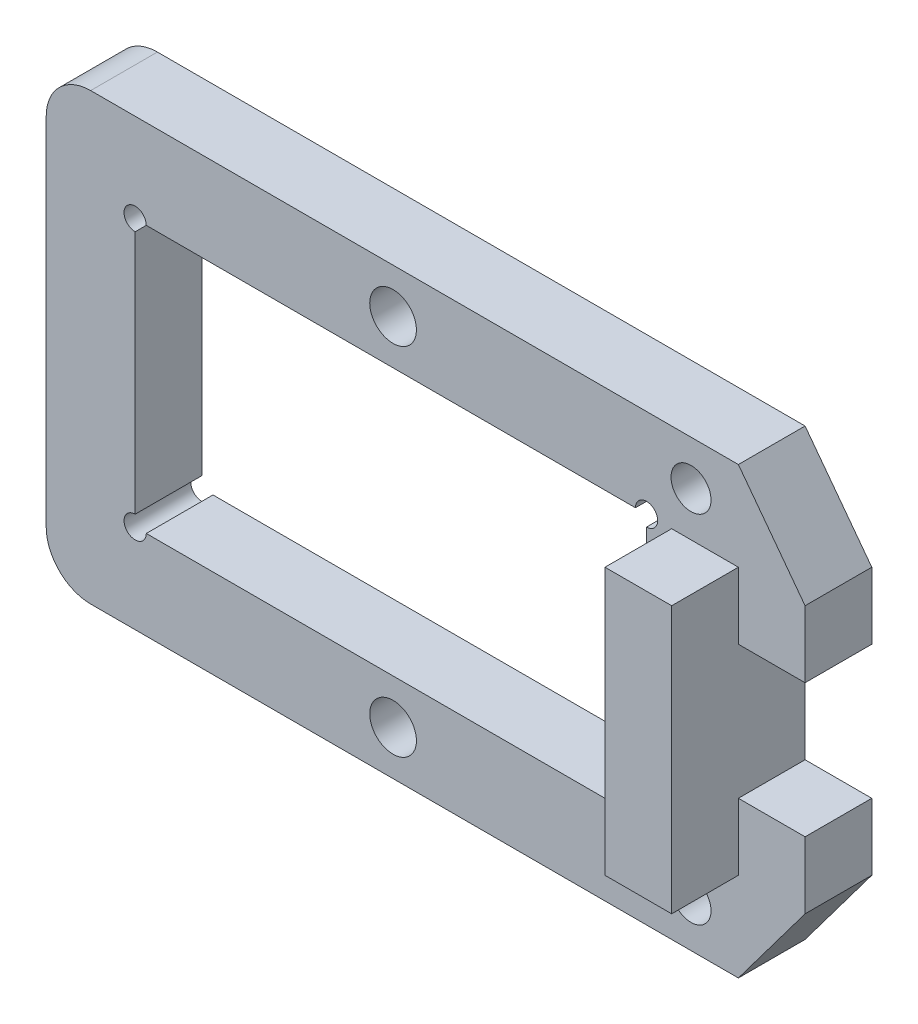
ISO-10303-21;
HEADER;
FILE_DESCRIPTION(('STEP AP214'),'2;1');
FILE_NAME('part.step','',(''),(''),'','','');
FILE_SCHEMA(('AUTOMOTIVE_DESIGN { 1 0 10303 214 1 1 1 1 }'));
ENDSEC;
DATA;
#1=APPLICATION_CONTEXT('core data for automotive mechanical design processes');
#2=APPLICATION_PROTOCOL_DEFINITION('international standard','automotive_design',2000,#1);
#3=PRODUCT_CONTEXT('',#1,'mechanical');
#4=PRODUCT('Part','Part','',(#3));
#5=PRODUCT_RELATED_PRODUCT_CATEGORY('part','',(#4));
#6=PRODUCT_DEFINITION_FORMATION('','',#4);
#7=PRODUCT_DEFINITION_CONTEXT('part definition',#1,'design');
#8=PRODUCT_DEFINITION('design','',#6,#7);
#9=PRODUCT_DEFINITION_SHAPE('','',#8);
#10=(LENGTH_UNIT() NAMED_UNIT(*) SI_UNIT(.MILLI.,.METRE.));
#11=(NAMED_UNIT(*) PLANE_ANGLE_UNIT() SI_UNIT($,.RADIAN.));
#12=(NAMED_UNIT(*) SI_UNIT($,.STERADIAN.) SOLID_ANGLE_UNIT());
#13=UNCERTAINTY_MEASURE_WITH_UNIT(LENGTH_MEASURE(1.E-05),#10,'distance_accuracy_value','');
#14=(GEOMETRIC_REPRESENTATION_CONTEXT(3) GLOBAL_UNCERTAINTY_ASSIGNED_CONTEXT((#13)) GLOBAL_UNIT_ASSIGNED_CONTEXT((#10,
#11,#12)) REPRESENTATION_CONTEXT('',''));
#15=CARTESIAN_POINT('',(0.,0.,0.));
#16=DIRECTION('',(0.,0.,1.));
#17=DIRECTION('',(1.,0.,0.));
#18=AXIS2_PLACEMENT_3D('',#15,#16,#17);
#19=CARTESIAN_POINT('',(26.7499927431345,15.9999988973141,-1.));
#20=DIRECTION('',(0.,1.,0.));
#21=DIRECTION('',(0.,0.,1.));
#22=AXIS2_PLACEMENT_3D('',#19,#20,#21);
#23=PLANE('',#22);
#24=DIRECTION('',(0.,0.,1.));
#25=VECTOR('',#24,1.);
#26=CARTESIAN_POINT('',(27.1299927431345,15.9999988973141,-1.));
#27=LINE('',#26,#25);
#28=CARTESIAN_POINT('',(27.1299927431345,15.9999988973141,-1.));
#29=VERTEX_POINT('',#28);
#30=CARTESIAN_POINT('',(27.1299927431345,15.9999988973141,2.));
#31=VERTEX_POINT('',#30);
#32=EDGE_CURVE('E393',#29,#31,#27,.T.);
#33=ORIENTED_EDGE('',*,*,#32,.F.);
#34=DIRECTION('',(-1.,0.,0.));
#35=VECTOR('',#34,1.);
#36=CARTESIAN_POINT('',(26.7499927431345,15.9999988973141,-1.));
#37=LINE('',#36,#35);
#38=CARTESIAN_POINT('',(-1.99999660622837,16.0000006891948,-1.));
#39=VERTEX_POINT('',#38);
#40=EDGE_CURVE('E314',#29,#39,#37,.T.);
#41=ORIENTED_EDGE('',*,*,#40,.T.);
#42=DIRECTION('',(0.,0.,1.));
#43=VECTOR('',#42,1.);
#44=CARTESIAN_POINT('',(-1.99999660622837,16.0000006891948,-1.));
#45=LINE('',#44,#43);
#46=CARTESIAN_POINT('',(-1.99999660622837,16.0000006891948,2.));
#47=VERTEX_POINT('',#46);
#48=EDGE_CURVE('E327',#39,#47,#45,.T.);
#49=ORIENTED_EDGE('',*,*,#48,.T.);
#50=DIRECTION('',(-1.,0.,0.));
#51=VECTOR('',#50,1.);
#52=CARTESIAN_POINT('',(26.7499927431345,15.9999988973141,2.));
#53=LINE('',#52,#51);
#54=EDGE_CURVE('E292',#31,#47,#53,.T.);
#55=ORIENTED_EDGE('',*,*,#54,.F.);
#56=EDGE_LOOP('',(#33,#41,#49,#55));
#57=FACE_BOUND('',#56,.T.);
#58=ADVANCED_FACE('F40',(#57),#23,.T.);
#59=CARTESIAN_POINT('',(26.7500020563602,-4.00000018998981,-1.));
#60=DIRECTION('',(1.2277400731051E-08,-1.,0.));
#61=DIRECTION('',(1.,1.2277400731051E-08,0.));
#62=AXIS2_PLACEMENT_3D('',#59,#60,#61);
#63=PLANE('',#62);
#64=DIRECTION('',(1.,1.2277400731051E-08,0.));
#65=VECTOR('',#64,1.);
#66=CARTESIAN_POINT('',(26.7500020563602,-4.00000018998981,-1.));
#67=LINE('',#66,#65);
#68=CARTESIAN_POINT('',(-2.00000016543505,-4.0000005429651,-1.));
#69=VERTEX_POINT('',#68);
#70=CARTESIAN_POINT('',(27.1300020563602,-4.00000018998981,-1.));
#71=VERTEX_POINT('',#70);
#72=EDGE_CURVE('E325',#69,#71,#67,.T.);
#73=ORIENTED_EDGE('',*,*,#72,.T.);
#74=DIRECTION('',(0.,0.,1.));
#75=VECTOR('',#74,1.);
#76=CARTESIAN_POINT('',(27.1300020563602,-4.00000018998981,-1.));
#77=LINE('',#76,#75);
#78=CARTESIAN_POINT('',(27.1300020563602,-4.00000018998981,2.));
#79=VERTEX_POINT('',#78);
#80=EDGE_CURVE('E407',#71,#79,#77,.T.);
#81=ORIENTED_EDGE('',*,*,#80,.T.);
#82=DIRECTION('',(1.,1.2277400731051E-08,0.));
#83=VECTOR('',#82,1.);
#84=CARTESIAN_POINT('',(26.7500020563602,-4.00000018998981,2.));
#85=LINE('',#84,#83);
#86=CARTESIAN_POINT('',(-2.00000016543505,-4.0000005429651,2.));
#87=VERTEX_POINT('',#86);
#88=EDGE_CURVE('E303',#87,#79,#85,.T.);
#89=ORIENTED_EDGE('',*,*,#88,.F.);
#90=DIRECTION('',(0.,0.,1.));
#91=VECTOR('',#90,1.);
#92=CARTESIAN_POINT('',(-2.00000016543505,-4.0000005429651,-1.));
#93=LINE('',#92,#91);
#94=EDGE_CURVE('E328',#69,#87,#93,.T.);
#95=ORIENTED_EDGE('',*,*,#94,.F.);
#96=EDGE_LOOP('',(#73,#81,#89,#95));
#97=FACE_BOUND('',#96,.T.);
#98=ADVANCED_FACE('F383',(#97),#63,.T.);
#99=CARTESIAN_POINT('',(11.5999998100102,-2.00000037599245,-1.));
#100=DIRECTION('',(0.,0.,1.));
#101=DIRECTION('',(1.,0.,0.));
#102=AXIS2_PLACEMENT_3D('',#99,#100,#101);
#103=CYLINDRICAL_SURFACE('',#102,1.05);
#104=CARTESIAN_POINT('',(11.5999998100102,-2.00000037599245,2.));
#105=DIRECTION('',(0.,0.,1.));
#106=DIRECTION('',(1.,0.,0.));
#107=AXIS2_PLACEMENT_3D('',#104,#105,#106);
#108=CIRCLE('',#107,1.05);
#109=CARTESIAN_POINT('',(12.6499998100102,-2.00000037599245,2.));
#110=VERTEX_POINT('',#109);
#111=EDGE_CURVE('E289',#110,#110,#108,.T.);
#112=ORIENTED_EDGE('',*,*,#111,.T.);
#113=EDGE_LOOP('',(#112));
#114=FACE_BOUND('',#113,.T.);
#115=CARTESIAN_POINT('',(11.5999998100102,-2.00000037599245,-1.));
#116=DIRECTION('',(0.,0.,-1.));
#117=DIRECTION('',(-1.,0.,0.));
#118=AXIS2_PLACEMENT_3D('',#115,#116,#117);
#119=CIRCLE('',#118,1.05);
#120=CARTESIAN_POINT('',(10.5499998100102,-2.00000037599245,-1.));
#121=VERTEX_POINT('',#120);
#122=EDGE_CURVE('E468',#121,#121,#119,.F.);
#123=ORIENTED_EDGE('',*,*,#122,.F.);
#124=EDGE_LOOP('',(#123));
#125=FACE_BOUND('',#124,.T.);
#126=ADVANCED_FACE('F388',(#114,#125),#103,.F.);
#127=CARTESIAN_POINT('',(11.5999998100102,13.9999987303414,-1.));
#128=DIRECTION('',(0.,0.,1.));
#129=DIRECTION('',(1.,0.,0.));
#130=AXIS2_PLACEMENT_3D('',#127,#128,#129);
#131=CYLINDRICAL_SURFACE('',#130,1.05);
#132=CARTESIAN_POINT('',(11.5999998100102,13.9999987303414,2.));
#133=DIRECTION('',(0.,0.,1.));
#134=DIRECTION('',(-1.,0.,0.));
#135=AXIS2_PLACEMENT_3D('',#132,#133,#134);
#136=CIRCLE('',#135,1.05);
#137=CARTESIAN_POINT('',(10.5499998100102,13.9999987303414,2.));
#138=VERTEX_POINT('',#137);
#139=EDGE_CURVE('E286',#138,#138,#136,.T.);
#140=ORIENTED_EDGE('',*,*,#139,.T.);
#141=EDGE_LOOP('',(#140));
#142=FACE_BOUND('',#141,.T.);
#143=CARTESIAN_POINT('',(11.5999998100102,13.9999987303414,-1.));
#144=DIRECTION('',(0.,0.,-1.));
#145=DIRECTION('',(-1.,0.,0.));
#146=AXIS2_PLACEMENT_3D('',#143,#144,#145);
#147=CIRCLE('',#146,1.05);
#148=CARTESIAN_POINT('',(10.5499998100102,13.9999987303414,-1.));
#149=VERTEX_POINT('',#148);
#150=EDGE_CURVE('E470',#149,#149,#147,.F.);
#151=ORIENTED_EDGE('',*,*,#150,.F.);
#152=EDGE_LOOP('',(#151));
#153=FACE_BOUND('',#152,.T.);
#154=ADVANCED_FACE('F532',(#142,#153),#131,.F.);
#155=CARTESIAN_POINT('',(22.9999998100102,-8.22825516055836E-07,-1.));
#156=DIRECTION('',(0.,-1.,0.));
#157=DIRECTION('',(1.,0.,0.));
#158=AXIS2_PLACEMENT_3D('',#155,#156,#157);
#159=PLANE('',#158);
#160=DIRECTION('',(1.,0.,0.));
#161=VECTOR('',#160,1.);
#162=CARTESIAN_POINT('',(22.9999998100102,-8.22825516055836E-07,-1.));
#163=LINE('',#162,#161);
#164=CARTESIAN_POINT('',(0.499999810010197,-8.22825517752848E-07,-0.999999999999999));
#165=VERTEX_POINT('',#164);
#166=CARTESIAN_POINT('',(22.4999998100102,-8.22825516093548E-07,-1.));
#167=VERTEX_POINT('',#166);
#168=EDGE_CURVE('E54',#165,#167,#163,.T.);
#169=ORIENTED_EDGE('',*,*,#168,.F.);
#170=DIRECTION('',(0.,0.,1.));
#171=VECTOR('',#170,1.);
#172=CARTESIAN_POINT('',(0.499999810010197,-8.22825517752848E-07,-9.));
#173=LINE('',#172,#171);
#174=CARTESIAN_POINT('',(0.499999810010197,-8.22825517752848E-07,2.));
#175=VERTEX_POINT('',#174);
#176=EDGE_CURVE('E266',#165,#175,#173,.T.);
#177=ORIENTED_EDGE('',*,*,#176,.T.);
#178=DIRECTION('',(1.,0.,0.));
#179=VECTOR('',#178,1.);
#180=CARTESIAN_POINT('',(22.9999998100102,-8.22825516055836E-07,2.));
#181=LINE('',#180,#179);
#182=CARTESIAN_POINT('',(22.4999998100102,-8.22825516093548E-07,2.));
#183=VERTEX_POINT('',#182);
#184=EDGE_CURVE('E283',#175,#183,#181,.T.);
#185=ORIENTED_EDGE('',*,*,#184,.T.);
#186=DIRECTION('',(0.,0.,1.));
#187=VECTOR('',#186,1.);
#188=CARTESIAN_POINT('',(22.4999998100102,-8.22825516093548E-07,-9.));
#189=LINE('',#188,#187);
#190=EDGE_CURVE('E12',#183,#167,#189,.F.);
#191=ORIENTED_EDGE('',*,*,#190,.T.);
#192=EDGE_LOOP('',(#169,#177,#185,#191));
#193=FACE_BOUND('',#192,.T.);
#194=ADVANCED_FACE('F365',(#193),#159,.F.);
#195=CARTESIAN_POINT('',(22.9999998100102,11.9999991771745,-1.));
#196=DIRECTION('',(0.,1.,0.));
#197=DIRECTION('',(-1.,0.,0.));
#198=AXIS2_PLACEMENT_3D('',#195,#196,#197);
#199=PLANE('',#198);
#200=DIRECTION('',(-1.,0.,0.));
#201=VECTOR('',#200,1.);
#202=CARTESIAN_POINT('',(22.9999998100102,11.9999991771745,-1.));
#203=LINE('',#202,#201);
#204=CARTESIAN_POINT('',(22.4999998100102,11.9999991771745,-0.999999999999999));
#205=VERTEX_POINT('',#204);
#206=CARTESIAN_POINT('',(0.499999810010195,11.9999991771745,-1.));
#207=VERTEX_POINT('',#206);
#208=EDGE_CURVE('E308',#205,#207,#203,.T.);
#209=ORIENTED_EDGE('',*,*,#208,.F.);
#210=DIRECTION('',(0.,0.,1.));
#211=VECTOR('',#210,1.);
#212=CARTESIAN_POINT('',(22.4999998100102,11.9999991771745,-9.));
#213=LINE('',#212,#211);
#214=CARTESIAN_POINT('',(22.4999998100102,11.9999991771745,2.));
#215=VERTEX_POINT('',#214);
#216=EDGE_CURVE('E339',#205,#215,#213,.T.);
#217=ORIENTED_EDGE('',*,*,#216,.T.);
#218=DIRECTION('',(-1.,0.,0.));
#219=VECTOR('',#218,1.);
#220=CARTESIAN_POINT('',(22.9999998100102,11.9999991771745,2.));
#221=LINE('',#220,#219);
#222=CARTESIAN_POINT('',(0.499999810010197,11.9999991771745,2.));
#223=VERTEX_POINT('',#222);
#224=EDGE_CURVE('E277',#215,#223,#221,.T.);
#225=ORIENTED_EDGE('',*,*,#224,.T.);
#226=DIRECTION('',(0.,0.,1.));
#227=VECTOR('',#226,1.);
#228=CARTESIAN_POINT('',(0.499999810010197,11.9999991771745,-9.));
#229=LINE('',#228,#227);
#230=EDGE_CURVE('E330',#223,#207,#229,.F.);
#231=ORIENTED_EDGE('',*,*,#230,.T.);
#232=EDGE_LOOP('',(#209,#217,#225,#231));
#233=FACE_BOUND('',#232,.T.);
#234=ADVANCED_FACE('F354',(#233),#199,.F.);
#235=CARTESIAN_POINT('',(-1.99999660622837,13.9999988973141,2.));
#236=DIRECTION('',(0.,0.,-1.));
#237=DIRECTION('',(-1.,0.,0.));
#238=AXIS2_PLACEMENT_3D('',#235,#236,#237);
#239=PLANE('',#238);
#240=ORIENTED_EDGE('',*,*,#224,.F.);
#241=CARTESIAN_POINT('',(22.9999998100102,11.9999991771745,2.));
#242=DIRECTION('',(0.,0.,1.));
#243=DIRECTION('',(1.,0.,0.));
#244=AXIS2_PLACEMENT_3D('',#241,#242,#243);
#245=CIRCLE('',#244,0.499999999999999);
#246=CARTESIAN_POINT('',(22.9999998100102,11.4999991771745,2.));
#247=VERTEX_POINT('',#246);
#248=EDGE_CURVE('E212',#247,#215,#245,.T.);
#249=ORIENTED_EDGE('',*,*,#248,.F.);
#250=DIRECTION('',(0.,1.,0.));
#251=VECTOR('',#250,1.);
#252=CARTESIAN_POINT('',(22.9999998100102,11.9999991771745,2.));
#253=LINE('',#252,#251);
#254=CARTESIAN_POINT('',(22.9999998100102,0.499999177174483,2.));
#255=VERTEX_POINT('',#254);
#256=EDGE_CURVE('E274',#255,#247,#253,.T.);
#257=ORIENTED_EDGE('',*,*,#256,.F.);
#258=CARTESIAN_POINT('',(22.9999998100102,-8.22825516055836E-07,2.));
#259=DIRECTION('',(0.,0.,1.));
#260=DIRECTION('',(1.,0.,0.));
#261=AXIS2_PLACEMENT_3D('',#258,#259,#260);
#262=CIRCLE('',#261,0.499999999999999);
#263=EDGE_CURVE('E250',#183,#255,#262,.T.);
#264=ORIENTED_EDGE('',*,*,#263,.F.);
#265=ORIENTED_EDGE('',*,*,#184,.F.);
#266=CARTESIAN_POINT('',(-1.89989803403567E-07,-8.22825517639714E-07,2.));
#267=DIRECTION('',(0.,0.,1.));
#268=DIRECTION('',(1.,0.,0.));
#269=AXIS2_PLACEMENT_3D('',#266,#267,#268);
#270=CIRCLE('',#269,0.5);
#271=CARTESIAN_POINT('',(-1.89989803403567E-07,0.499999177174482,2.));
#272=VERTEX_POINT('',#271);
#273=EDGE_CURVE('E247',#272,#175,#270,.T.);
#274=ORIENTED_EDGE('',*,*,#273,.F.);
#275=DIRECTION('',(0.,-1.,0.));
#276=VECTOR('',#275,1.);
#277=CARTESIAN_POINT('',(-1.89989803403567E-07,11.9999991771745,2.));
#278=LINE('',#277,#276);
#279=CARTESIAN_POINT('',(-1.89989803403567E-07,11.4999991771745,2.));
#280=VERTEX_POINT('',#279);
#281=EDGE_CURVE('E280',#280,#272,#278,.T.);
#282=ORIENTED_EDGE('',*,*,#281,.F.);
#283=CARTESIAN_POINT('',(-1.89989803403567E-07,11.9999991771745,2.));
#284=DIRECTION('',(0.,0.,1.));
#285=DIRECTION('',(1.,0.,0.));
#286=AXIS2_PLACEMENT_3D('',#283,#284,#285);
#287=CIRCLE('',#286,0.5);
#288=EDGE_CURVE('E249',#223,#280,#287,.T.);
#289=ORIENTED_EDGE('',*,*,#288,.F.);
#290=EDGE_LOOP('',(#240,#249,#257,#264,#265,#274,#282,#289));
#291=FACE_BOUND('',#290,.T.);
#292=ORIENTED_EDGE('',*,*,#111,.F.);
#293=EDGE_LOOP('',(#292));
#294=FACE_BOUND('',#293,.T.);
#295=ORIENTED_EDGE('',*,*,#139,.F.);
#296=EDGE_LOOP('',(#295));
#297=FACE_BOUND('',#296,.T.);
#298=ORIENTED_EDGE('',*,*,#88,.T.);
#299=DIRECTION('',(0.599999831878138,0.800000126091369,0.));
#300=VECTOR('',#299,1.);
#301=CARTESIAN_POINT('',(30.1300006854534,-2.66596633657912E-07,2.));
#302=LINE('',#301,#300);
#303=CARTESIAN_POINT('',(30.1300006854534,-2.66596633657912E-07,2.));
#304=VERTEX_POINT('',#303);
#305=EDGE_CURVE('E447',#79,#304,#302,.T.);
#306=ORIENTED_EDGE('',*,*,#305,.T.);
#307=DIRECTION('',(1.86264626855528E-06,0.999999999998265,0.));
#308=VECTOR('',#307,1.);
#309=CARTESIAN_POINT('',(30.1300062733889,2.99999793060124,2.));
#310=LINE('',#309,#308);
#311=CARTESIAN_POINT('',(30.1300062733889,2.99999793060124,2.));
#312=VERTEX_POINT('',#311);
#313=EDGE_CURVE('E445',#304,#312,#310,.T.);
#314=ORIENTED_EDGE('',*,*,#313,.T.);
#315=DIRECTION('',(-1.,-5.72169204784613E-13,0.));
#316=VECTOR('',#315,1.);
#317=CARTESIAN_POINT('',(27.1300040622856,2.99999793059952,2.));
#318=LINE('',#317,#316);
#319=CARTESIAN_POINT('',(27.1300040622856,2.99999793059952,2.));
#320=VERTEX_POINT('',#319);
#321=EDGE_CURVE('E209',#312,#320,#318,.T.);
#322=ORIENTED_EDGE('',*,*,#321,.T.);
#323=DIRECTION('',(0.,1.,0.));
#324=VECTOR('',#323,1.);
#325=CARTESIAN_POINT('',(27.1300020563602,-2.84261419958298E-07,2.));
#326=LINE('',#325,#324);
#327=CARTESIAN_POINT('',(27.1300020563602,-2.84261419958298E-07,2.));
#328=VERTEX_POINT('',#327);
#329=EDGE_CURVE('E201',#328,#320,#326,.T.);
#330=ORIENTED_EDGE('',*,*,#329,.F.);
#331=DIRECTION('',(1.,0.,0.));
#332=VECTOR('',#331,1.);
#333=CARTESIAN_POINT('',(27.1300020563602,-2.84261419958298E-07,2.));
#334=LINE('',#333,#332);
#335=CARTESIAN_POINT('',(24.1300015646219,-2.84261419958298E-07,2.));
#336=VERTEX_POINT('',#335);
#337=EDGE_CURVE('E205',#336,#328,#334,.T.);
#338=ORIENTED_EDGE('',*,*,#337,.F.);
#339=DIRECTION('',(0.,-1.,0.));
#340=VECTOR('',#339,1.);
#341=CARTESIAN_POINT('',(24.1300015646219,-2.84261419958298E-07,2.));
#342=LINE('',#341,#340);
#343=CARTESIAN_POINT('',(24.1300015646219,12.0000001043081,2.));
#344=VERTEX_POINT('',#343);
#345=EDGE_CURVE('E225',#344,#336,#342,.T.);
#346=ORIENTED_EDGE('',*,*,#345,.F.);
#347=DIRECTION('',(-1.,0.,0.));
#348=VECTOR('',#347,1.);
#349=CARTESIAN_POINT('',(27.1300020563602,12.0000001043081,2.));
#350=LINE('',#349,#348);
#351=CARTESIAN_POINT('',(27.1300020563602,12.0000001043081,2.));
#352=VERTEX_POINT('',#351);
#353=EDGE_CURVE('E213',#352,#344,#350,.T.);
#354=ORIENTED_EDGE('',*,*,#353,.F.);
#355=CARTESIAN_POINT('',(27.1300057816505,8.99999774992466,2.));
#356=VERTEX_POINT('',#355);
#357=EDGE_CURVE('E215',#356,#352,#326,.T.);
#358=ORIENTED_EDGE('',*,*,#357,.F.);
#359=DIRECTION('',(1.,0.,0.));
#360=VECTOR('',#359,1.);
#361=CARTESIAN_POINT('',(30.1300062733889,8.99999774992466,2.));
#362=LINE('',#361,#360);
#363=CARTESIAN_POINT('',(30.1300062733889,8.99999774992466,2.));
#364=VERTEX_POINT('',#363);
#365=EDGE_CURVE('E441',#356,#364,#362,.T.);
#366=ORIENTED_EDGE('',*,*,#365,.T.);
#367=DIRECTION('',(-4.34616860398201E-06,0.999999999990555,0.));
#368=VECTOR('',#367,1.);
#369=CARTESIAN_POINT('',(30.1299932348728,12.0000001043081,2.));
#370=LINE('',#369,#368);
#371=CARTESIAN_POINT('',(30.1299932348728,12.0000001043081,2.));
#372=VERTEX_POINT('',#371);
#373=EDGE_CURVE('E438',#364,#372,#370,.T.);
#374=ORIENTED_EDGE('',*,*,#373,.T.);
#375=DIRECTION('',(-0.600000178813943,0.799999865889511,0.));
#376=VECTOR('',#375,1.);
#377=CARTESIAN_POINT('',(27.1299927431345,15.9999988973141,2.));
#378=LINE('',#377,#376);
#379=EDGE_CURVE('E436',#372,#31,#378,.T.);
#380=ORIENTED_EDGE('',*,*,#379,.T.);
#381=ORIENTED_EDGE('',*,*,#54,.T.);
#382=CARTESIAN_POINT('',(-1.99999660622837,13.9999988973141,2.));
#383=DIRECTION('',(0.,0.,1.));
#384=DIRECTION('',(-1.,0.,0.));
#385=AXIS2_PLACEMENT_3D('',#382,#383,#384);
#386=CIRCLE('',#385,2.00000179188074);
#387=CARTESIAN_POINT('',(-4.00000018998981,13.9999984493439,2.));
#388=VERTEX_POINT('',#387);
#389=EDGE_CURVE('E294',#47,#388,#386,.T.);
#390=ORIENTED_EDGE('',*,*,#389,.T.);
#391=DIRECTION('',(0.,-1.,0.));
#392=VECTOR('',#391,1.);
#393=CARTESIAN_POINT('',(-4.00000018998981,-2.0000000949949,2.));
#394=LINE('',#393,#392);
#395=CARTESIAN_POINT('',(-4.0000001899898,-2.0000000949949,2.));
#396=VERTEX_POINT('',#395);
#397=EDGE_CURVE('E297',#388,#396,#394,.T.);
#398=ORIENTED_EDGE('',*,*,#397,.T.);
#399=CARTESIAN_POINT('',(-2.00000018998985,-2.0000005429651,2.));
#400=DIRECTION('',(0.,0.,1.));
#401=DIRECTION('',(-1.,0.,0.));
#402=AXIS2_PLACEMENT_3D('',#399,#400,#401);
#403=CIRCLE('',#402,2.);
#404=EDGE_CURVE('E300',#396,#87,#403,.T.);
#405=ORIENTED_EDGE('',*,*,#404,.T.);
#406=EDGE_LOOP('',(#298,#306,#314,#322,#330,#338,#346,#354,#358,#366,#374,#380,#381,#390,#398,#405));
#407=FACE_BOUND('',#406,.T.);
#408=CARTESIAN_POINT('',(24.9999845424924,-2.00000054296511,2.));
#409=DIRECTION('',(0.,0.,1.));
#410=DIRECTION('',(-1.,0.,0.));
#411=AXIS2_PLACEMENT_3D('',#408,#409,#410);
#412=CIRCLE('',#411,0.9);
#413=CARTESIAN_POINT('',(24.0999845424924,-2.00000054296511,2.));
#414=VERTEX_POINT('',#413);
#415=EDGE_CURVE('E453',#414,#414,#412,.T.);
#416=ORIENTED_EDGE('',*,*,#415,.F.);
#417=EDGE_LOOP('',(#416));
#418=FACE_BOUND('',#417,.T.);
#419=CARTESIAN_POINT('',(24.9999845424924,13.9999988973141,2.));
#420=DIRECTION('',(0.,0.,1.));
#421=DIRECTION('',(1.,0.,0.));
#422=AXIS2_PLACEMENT_3D('',#419,#420,#421);
#423=CIRCLE('',#422,0.9);
#424=CARTESIAN_POINT('',(25.8999845424924,13.9999988973141,2.));
#425=VERTEX_POINT('',#424);
#426=EDGE_CURVE('E450',#425,#425,#423,.T.);
#427=ORIENTED_EDGE('',*,*,#426,.F.);
#428=EDGE_LOOP('',(#427));
#429=FACE_BOUND('',#428,.T.);
#430=ADVANCED_FACE('F203',(#291,#294,#297,#407,#418,#429),#239,.F.);
#431=CARTESIAN_POINT('',(-1.99999660622837,13.9999988973141,-1.));
#432=DIRECTION('',(0.,0.,-1.));
#433=DIRECTION('',(-1.,0.,0.));
#434=AXIS2_PLACEMENT_3D('',#431,#432,#433);
#435=PLANE('',#434);
#436=ORIENTED_EDGE('',*,*,#208,.T.);
#437=CARTESIAN_POINT('',(-1.89989803403567E-07,11.9999991771745,-0.999999999999999));
#438=DIRECTION('',(0.,0.,-1.));
#439=DIRECTION('',(-1.,0.,0.));
#440=AXIS2_PLACEMENT_3D('',#437,#438,#439);
#441=CIRCLE('',#440,0.5);
#442=CARTESIAN_POINT('',(-1.89989803403567E-07,11.4999991771745,-0.999999999999999));
#443=VERTEX_POINT('',#442);
#444=EDGE_CURVE('E254',#443,#207,#441,.T.);
#445=ORIENTED_EDGE('',*,*,#444,.F.);
#446=DIRECTION('',(0.,-1.,0.));
#447=VECTOR('',#446,1.);
#448=CARTESIAN_POINT('',(-1.89989803403567E-07,11.9999991771745,-1.));
#449=LINE('',#448,#447);
#450=CARTESIAN_POINT('',(-1.89989803403567E-07,0.499999177174483,-1.));
#451=VERTEX_POINT('',#450);
#452=EDGE_CURVE('E310',#443,#451,#449,.T.);
#453=ORIENTED_EDGE('',*,*,#452,.T.);
#454=CARTESIAN_POINT('',(-1.89989803403567E-07,-8.22825517639714E-07,-0.999999999999999));
#455=DIRECTION('',(0.,0.,-1.));
#456=DIRECTION('',(-1.,0.,0.));
#457=AXIS2_PLACEMENT_3D('',#454,#455,#456);
#458=CIRCLE('',#457,0.5);
#459=EDGE_CURVE('E61',#165,#451,#458,.T.);
#460=ORIENTED_EDGE('',*,*,#459,.F.);
#461=ORIENTED_EDGE('',*,*,#168,.T.);
#462=CARTESIAN_POINT('',(22.9999998100102,-8.22825516055836E-07,-0.999999999999999));
#463=DIRECTION('',(0.,0.,-1.));
#464=DIRECTION('',(-1.,0.,0.));
#465=AXIS2_PLACEMENT_3D('',#462,#463,#464);
#466=CIRCLE('',#465,0.499999999999999);
#467=CARTESIAN_POINT('',(22.9999998100102,0.499999177174483,-0.999999999999999));
#468=VERTEX_POINT('',#467);
#469=EDGE_CURVE('E269',#468,#167,#466,.T.);
#470=ORIENTED_EDGE('',*,*,#469,.F.);
#471=DIRECTION('',(0.,1.,0.));
#472=VECTOR('',#471,1.);
#473=CARTESIAN_POINT('',(22.9999998100102,11.9999991771745,-1.));
#474=LINE('',#473,#472);
#475=CARTESIAN_POINT('',(22.9999998100102,11.4999991771745,-0.999999999999999));
#476=VERTEX_POINT('',#475);
#477=EDGE_CURVE('E305',#468,#476,#474,.T.);
#478=ORIENTED_EDGE('',*,*,#477,.T.);
#479=CARTESIAN_POINT('',(22.9999998100102,11.9999991771745,-0.999999999999999));
#480=DIRECTION('',(0.,0.,-1.));
#481=DIRECTION('',(-1.,0.,0.));
#482=AXIS2_PLACEMENT_3D('',#479,#480,#481);
#483=CIRCLE('',#482,0.499999999999999);
#484=EDGE_CURVE('E260',#205,#476,#483,.T.);
#485=ORIENTED_EDGE('',*,*,#484,.F.);
#486=EDGE_LOOP('',(#436,#445,#453,#460,#461,#470,#478,#485));
#487=FACE_BOUND('',#486,.T.);
#488=ORIENTED_EDGE('',*,*,#40,.F.);
#489=DIRECTION('',(-0.600000178813943,0.799999865889511,0.));
#490=VECTOR('',#489,1.);
#491=CARTESIAN_POINT('',(27.1299927431345,15.9999988973141,-1.));
#492=LINE('',#491,#490);
#493=CARTESIAN_POINT('',(30.1299932348728,12.0000001043081,-1.));
#494=VERTEX_POINT('',#493);
#495=EDGE_CURVE('E402',#494,#29,#492,.T.);
#496=ORIENTED_EDGE('',*,*,#495,.F.);
#497=DIRECTION('',(-4.34616860398201E-06,0.999999999990555,0.));
#498=VECTOR('',#497,1.);
#499=CARTESIAN_POINT('',(30.1299932348728,12.0000001043081,-1.));
#500=LINE('',#499,#498);
#501=CARTESIAN_POINT('',(30.1300062733889,8.99999774992466,-1.));
#502=VERTEX_POINT('',#501);
#503=EDGE_CURVE('E406',#502,#494,#500,.T.);
#504=ORIENTED_EDGE('',*,*,#503,.F.);
#505=DIRECTION('',(1.,0.,0.));
#506=VECTOR('',#505,1.);
#507=CARTESIAN_POINT('',(30.1300062733889,8.99999774992466,-1.));
#508=LINE('',#507,#506);
#509=CARTESIAN_POINT('',(27.1300057816505,8.99999774992466,-1.));
#510=VERTEX_POINT('',#509);
#511=EDGE_CURVE('E409',#510,#502,#508,.T.);
#512=ORIENTED_EDGE('',*,*,#511,.F.);
#513=DIRECTION('',(2.86560837514496E-07,0.999999999999959,0.));
#514=VECTOR('',#513,1.);
#515=CARTESIAN_POINT('',(27.1300057816505,8.99999774992466,-1.));
#516=LINE('',#515,#514);
#517=CARTESIAN_POINT('',(27.1300040622856,2.99999793059952,-1.));
#518=VERTEX_POINT('',#517);
#519=EDGE_CURVE('E418',#518,#510,#516,.T.);
#520=ORIENTED_EDGE('',*,*,#519,.F.);
#521=DIRECTION('',(-1.,-5.72169204784613E-13,0.));
#522=VECTOR('',#521,1.);
#523=CARTESIAN_POINT('',(27.1300040622856,2.99999793059952,-1.));
#524=LINE('',#523,#522);
#525=CARTESIAN_POINT('',(30.1300062733889,2.99999793060124,-1.));
#526=VERTEX_POINT('',#525);
#527=EDGE_CURVE('E421',#526,#518,#524,.T.);
#528=ORIENTED_EDGE('',*,*,#527,.F.);
#529=DIRECTION('',(1.86264626855528E-06,0.999999999998265,0.));
#530=VECTOR('',#529,1.);
#531=CARTESIAN_POINT('',(30.1300062733889,2.99999793060124,-1.));
#532=LINE('',#531,#530);
#533=CARTESIAN_POINT('',(30.1300006854534,-2.66596633657912E-07,-1.));
#534=VERTEX_POINT('',#533);
#535=EDGE_CURVE('E424',#534,#526,#532,.T.);
#536=ORIENTED_EDGE('',*,*,#535,.F.);
#537=DIRECTION('',(0.599999831878138,0.800000126091369,0.));
#538=VECTOR('',#537,1.);
#539=CARTESIAN_POINT('',(30.1300006854534,-2.66596633657912E-07,-1.));
#540=LINE('',#539,#538);
#541=EDGE_CURVE('E427',#71,#534,#540,.T.);
#542=ORIENTED_EDGE('',*,*,#541,.F.);
#543=ORIENTED_EDGE('',*,*,#72,.F.);
#544=CARTESIAN_POINT('',(-2.00000018998985,-2.0000005429651,-1.));
#545=DIRECTION('',(0.,0.,1.));
#546=DIRECTION('',(-1.,0.,0.));
#547=AXIS2_PLACEMENT_3D('',#544,#545,#546);
#548=CIRCLE('',#547,2.);
#549=CARTESIAN_POINT('',(-4.0000001899898,-2.0000000949949,-1.));
#550=VERTEX_POINT('',#549);
#551=EDGE_CURVE('E322',#550,#69,#548,.T.);
#552=ORIENTED_EDGE('',*,*,#551,.F.);
#553=DIRECTION('',(0.,-1.,0.));
#554=VECTOR('',#553,1.);
#555=CARTESIAN_POINT('',(-4.00000018998981,-2.0000000949949,-1.));
#556=LINE('',#555,#554);
#557=CARTESIAN_POINT('',(-4.00000018998981,13.9999984493439,-1.));
#558=VERTEX_POINT('',#557);
#559=EDGE_CURVE('E319',#558,#550,#556,.T.);
#560=ORIENTED_EDGE('',*,*,#559,.F.);
#561=CARTESIAN_POINT('',(-1.99999660622837,13.9999988973141,-1.));
#562=DIRECTION('',(0.,0.,1.));
#563=DIRECTION('',(-1.,0.,0.));
#564=AXIS2_PLACEMENT_3D('',#561,#562,#563);
#565=CIRCLE('',#564,2.00000179188074);
#566=EDGE_CURVE('E316',#39,#558,#565,.T.);
#567=ORIENTED_EDGE('',*,*,#566,.F.);
#568=EDGE_LOOP('',(#488,#496,#504,#512,#520,#528,#536,#542,#543,#552,#560,#567));
#569=FACE_BOUND('',#568,.T.);
#570=ORIENTED_EDGE('',*,*,#150,.T.);
#571=EDGE_LOOP('',(#570));
#572=FACE_BOUND('',#571,.T.);
#573=CARTESIAN_POINT('',(24.9999845424924,13.9999988973141,-1.));
#574=DIRECTION('',(0.,0.,1.));
#575=DIRECTION('',(1.,0.,0.));
#576=AXIS2_PLACEMENT_3D('',#573,#574,#575);
#577=CIRCLE('',#576,0.9);
#578=CARTESIAN_POINT('',(25.8999845424924,13.9999988973141,-1.));
#579=VERTEX_POINT('',#578);
#580=EDGE_CURVE('E430',#579,#579,#577,.T.);
#581=ORIENTED_EDGE('',*,*,#580,.T.);
#582=EDGE_LOOP('',(#581));
#583=FACE_BOUND('',#582,.T.);
#584=CARTESIAN_POINT('',(24.9999845424924,-2.00000054296511,-1.));
#585=DIRECTION('',(0.,0.,1.));
#586=DIRECTION('',(-1.,0.,0.));
#587=AXIS2_PLACEMENT_3D('',#584,#585,#586);
#588=CIRCLE('',#587,0.9);
#589=CARTESIAN_POINT('',(24.0999845424924,-2.00000054296511,-1.));
#590=VERTEX_POINT('',#589);
#591=EDGE_CURVE('E433',#590,#590,#588,.T.);
#592=ORIENTED_EDGE('',*,*,#591,.T.);
#593=EDGE_LOOP('',(#592));
#594=FACE_BOUND('',#593,.T.);
#595=ORIENTED_EDGE('',*,*,#122,.T.);
#596=EDGE_LOOP('',(#595));
#597=FACE_BOUND('',#596,.T.);
#598=ADVANCED_FACE('F347',(#487,#569,#572,#583,#594,#597),#435,.T.);
#599=CARTESIAN_POINT('',(-2.00000018998985,-2.0000005429651,-1.));
#600=DIRECTION('',(0.,0.,1.));
#601=DIRECTION('',(1.,0.,0.));
#602=AXIS2_PLACEMENT_3D('',#599,#600,#601);
#603=CYLINDRICAL_SURFACE('',#602,2.);
#604=ORIENTED_EDGE('',*,*,#94,.T.);
#605=ORIENTED_EDGE('',*,*,#404,.F.);
#606=DIRECTION('',(0.,0.,1.));
#607=VECTOR('',#606,1.);
#608=CARTESIAN_POINT('',(-4.0000001899898,-2.0000000949949,-1.));
#609=LINE('',#608,#607);
#610=EDGE_CURVE('E331',#550,#396,#609,.T.);
#611=ORIENTED_EDGE('',*,*,#610,.F.);
#612=ORIENTED_EDGE('',*,*,#551,.T.);
#613=EDGE_LOOP('',(#604,#605,#611,#612));
#614=FACE_BOUND('',#613,.T.);
#615=ADVANCED_FACE('F510',(#614),#603,.T.);
#616=CARTESIAN_POINT('',(-4.00000018998981,-2.0000000949949,-1.));
#617=DIRECTION('',(-1.,0.,0.));
#618=DIRECTION('',(0.,0.,1.));
#619=AXIS2_PLACEMENT_3D('',#616,#617,#618);
#620=PLANE('',#619);
#621=ORIENTED_EDGE('',*,*,#610,.T.);
#622=ORIENTED_EDGE('',*,*,#397,.F.);
#623=DIRECTION('',(0.,0.,1.));
#624=VECTOR('',#623,1.);
#625=CARTESIAN_POINT('',(-4.00000018998981,13.9999984493439,-1.));
#626=LINE('',#625,#624);
#627=EDGE_CURVE('E333',#558,#388,#626,.T.);
#628=ORIENTED_EDGE('',*,*,#627,.F.);
#629=ORIENTED_EDGE('',*,*,#559,.T.);
#630=EDGE_LOOP('',(#621,#622,#628,#629));
#631=FACE_BOUND('',#630,.T.);
#632=ADVANCED_FACE('F513',(#631),#620,.T.);
#633=CARTESIAN_POINT('',(-1.99999660622837,13.9999988973141,-1.));
#634=DIRECTION('',(0.,0.,1.));
#635=DIRECTION('',(1.,0.,0.));
#636=AXIS2_PLACEMENT_3D('',#633,#634,#635);
#637=CYLINDRICAL_SURFACE('',#636,2.00000179188074);
#638=ORIENTED_EDGE('',*,*,#627,.T.);
#639=ORIENTED_EDGE('',*,*,#389,.F.);
#640=ORIENTED_EDGE('',*,*,#48,.F.);
#641=ORIENTED_EDGE('',*,*,#566,.T.);
#642=EDGE_LOOP('',(#638,#639,#640,#641));
#643=FACE_BOUND('',#642,.T.);
#644=ADVANCED_FACE('F516',(#643),#637,.T.);
#645=CARTESIAN_POINT('',(22.9999998100102,11.9999991771745,-1.));
#646=DIRECTION('',(1.,0.,0.));
#647=DIRECTION('',(0.,0.,-1.));
#648=AXIS2_PLACEMENT_3D('',#645,#646,#647);
#649=PLANE('',#648);
#650=ORIENTED_EDGE('',*,*,#256,.T.);
#651=DIRECTION('',(0.,0.,1.));
#652=VECTOR('',#651,1.);
#653=CARTESIAN_POINT('',(22.9999998100102,11.4999991771745,-9.));
#654=LINE('',#653,#652);
#655=EDGE_CURVE('E262',#247,#476,#654,.F.);
#656=ORIENTED_EDGE('',*,*,#655,.T.);
#657=ORIENTED_EDGE('',*,*,#477,.F.);
#658=DIRECTION('',(0.,0.,1.));
#659=VECTOR('',#658,1.);
#660=CARTESIAN_POINT('',(22.9999998100102,0.499999177174483,-9.));
#661=LINE('',#660,#659);
#662=EDGE_CURVE('E271',#468,#255,#661,.T.);
#663=ORIENTED_EDGE('',*,*,#662,.T.);
#664=EDGE_LOOP('',(#650,#656,#657,#663));
#665=FACE_BOUND('',#664,.T.);
#666=ADVANCED_FACE('F369',(#665),#649,.F.);
#667=CARTESIAN_POINT('',(-1.89989803403567E-07,11.9999991771745,-1.));
#668=DIRECTION('',(-1.,0.,0.));
#669=DIRECTION('',(0.,0.,1.));
#670=AXIS2_PLACEMENT_3D('',#667,#668,#669);
#671=PLANE('',#670);
#672=ORIENTED_EDGE('',*,*,#281,.T.);
#673=DIRECTION('',(0.,0.,1.));
#674=VECTOR('',#673,1.);
#675=CARTESIAN_POINT('',(-1.89989803403567E-07,0.499999177174482,-9.));
#676=LINE('',#675,#674);
#677=EDGE_CURVE('E47',#272,#451,#676,.F.);
#678=ORIENTED_EDGE('',*,*,#677,.T.);
#679=ORIENTED_EDGE('',*,*,#452,.F.);
#680=DIRECTION('',(0.,0.,1.));
#681=VECTOR('',#680,1.);
#682=CARTESIAN_POINT('',(-1.89989803403567E-07,11.4999991771745,-9.));
#683=LINE('',#682,#681);
#684=EDGE_CURVE('E257',#443,#280,#683,.T.);
#685=ORIENTED_EDGE('',*,*,#684,.T.);
#686=EDGE_LOOP('',(#672,#678,#679,#685));
#687=FACE_BOUND('',#686,.T.);
#688=ADVANCED_FACE('F343',(#687),#671,.F.);
#689=CARTESIAN_POINT('',(-1.89989803403567E-07,11.9999991771745,-9.));
#690=DIRECTION('',(0.,0.,1.));
#691=DIRECTION('',(1.,0.,0.));
#692=AXIS2_PLACEMENT_3D('',#689,#690,#691);
#693=CYLINDRICAL_SURFACE('',#692,0.5);
#694=ORIENTED_EDGE('',*,*,#444,.T.);
#695=ORIENTED_EDGE('',*,*,#230,.F.);
#696=ORIENTED_EDGE('',*,*,#288,.T.);
#697=ORIENTED_EDGE('',*,*,#684,.F.);
#698=EDGE_LOOP('',(#694,#695,#696,#697));
#699=FACE_BOUND('',#698,.T.);
#700=ADVANCED_FACE('F351',(#699),#693,.F.);
#701=CARTESIAN_POINT('',(22.9999998100102,11.9999991771745,-9.));
#702=DIRECTION('',(0.,0.,1.));
#703=DIRECTION('',(1.,0.,0.));
#704=AXIS2_PLACEMENT_3D('',#701,#702,#703);
#705=CYLINDRICAL_SURFACE('',#704,0.499999999999999);
#706=ORIENTED_EDGE('',*,*,#248,.T.);
#707=ORIENTED_EDGE('',*,*,#216,.F.);
#708=ORIENTED_EDGE('',*,*,#484,.T.);
#709=ORIENTED_EDGE('',*,*,#655,.F.);
#710=EDGE_LOOP('',(#706,#707,#708,#709));
#711=FACE_BOUND('',#710,.T.);
#712=ADVANCED_FACE('F372',(#711),#705,.F.);
#713=CARTESIAN_POINT('',(-1.89989803403567E-07,-8.22825517639714E-07,-9.));
#714=DIRECTION('',(0.,0.,1.));
#715=DIRECTION('',(1.,0.,0.));
#716=AXIS2_PLACEMENT_3D('',#713,#714,#715);
#717=CYLINDRICAL_SURFACE('',#716,0.5);
#718=ORIENTED_EDGE('',*,*,#459,.T.);
#719=ORIENTED_EDGE('',*,*,#677,.F.);
#720=ORIENTED_EDGE('',*,*,#273,.T.);
#721=ORIENTED_EDGE('',*,*,#176,.F.);
#722=EDGE_LOOP('',(#718,#719,#720,#721));
#723=FACE_BOUND('',#722,.T.);
#724=ADVANCED_FACE('F363',(#723),#717,.F.);
#725=CARTESIAN_POINT('',(22.9999998100102,-8.22825516055836E-07,-9.));
#726=DIRECTION('',(0.,0.,1.));
#727=DIRECTION('',(1.,0.,0.));
#728=AXIS2_PLACEMENT_3D('',#725,#726,#727);
#729=CYLINDRICAL_SURFACE('',#728,0.499999999999999);
#730=ORIENTED_EDGE('',*,*,#469,.T.);
#731=ORIENTED_EDGE('',*,*,#190,.F.);
#732=ORIENTED_EDGE('',*,*,#263,.T.);
#733=ORIENTED_EDGE('',*,*,#662,.F.);
#734=EDGE_LOOP('',(#730,#731,#732,#733));
#735=FACE_BOUND('',#734,.T.);
#736=ADVANCED_FACE('F367',(#735),#729,.F.);
#737=CARTESIAN_POINT('',(0.38,0.,5.));
#738=DIRECTION('',(0.,0.,1.));
#739=DIRECTION('',(1.,0.,0.));
#740=AXIS2_PLACEMENT_3D('',#737,#738,#739);
#741=PLANE('',#740);
#742=DIRECTION('',(0.,1.,0.));
#743=VECTOR('',#742,1.);
#744=CARTESIAN_POINT('',(27.1300020563602,-2.84261419958298E-07,5.));
#745=LINE('',#744,#743);
#746=CARTESIAN_POINT('',(27.1300020563602,-2.84261419958298E-07,5.));
#747=VERTEX_POINT('',#746);
#748=CARTESIAN_POINT('',(27.1300020563602,12.0000001043081,5.));
#749=VERTEX_POINT('',#748);
#750=EDGE_CURVE('E226',#747,#749,#745,.T.);
#751=ORIENTED_EDGE('',*,*,#750,.T.);
#752=DIRECTION('',(-1.,0.,0.));
#753=VECTOR('',#752,1.);
#754=CARTESIAN_POINT('',(27.1300020563602,12.0000001043081,5.));
#755=LINE('',#754,#753);
#756=CARTESIAN_POINT('',(24.1300015646219,12.0000001043081,5.));
#757=VERTEX_POINT('',#756);
#758=EDGE_CURVE('E244',#749,#757,#755,.T.);
#759=ORIENTED_EDGE('',*,*,#758,.T.);
#760=DIRECTION('',(0.,-1.,0.));
#761=VECTOR('',#760,1.);
#762=CARTESIAN_POINT('',(24.1300015646219,-2.84261419958298E-07,5.));
#763=LINE('',#762,#761);
#764=CARTESIAN_POINT('',(24.1300015646219,-2.84261419958298E-07,5.));
#765=VERTEX_POINT('',#764);
#766=EDGE_CURVE('E234',#757,#765,#763,.T.);
#767=ORIENTED_EDGE('',*,*,#766,.T.);
#768=DIRECTION('',(1.,0.,0.));
#769=VECTOR('',#768,1.);
#770=CARTESIAN_POINT('',(27.1300020563602,-2.84261419958298E-07,5.));
#771=LINE('',#770,#769);
#772=EDGE_CURVE('E232',#765,#747,#771,.T.);
#773=ORIENTED_EDGE('',*,*,#772,.T.);
#774=EDGE_LOOP('',(#751,#759,#767,#773));
#775=FACE_BOUND('',#774,.T.);
#776=ADVANCED_FACE('F544',(#775),#741,.T.);
#777=CARTESIAN_POINT('',(27.1300020563602,12.0000001043081,5.));
#778=DIRECTION('',(0.,-1.,0.));
#779=DIRECTION('',(0.,0.,-1.));
#780=AXIS2_PLACEMENT_3D('',#777,#778,#779);
#781=PLANE('',#780);
#782=ORIENTED_EDGE('',*,*,#353,.T.);
#783=DIRECTION('',(0.,0.,-1.));
#784=VECTOR('',#783,1.);
#785=CARTESIAN_POINT('',(24.1300015646219,12.0000001043081,5.));
#786=LINE('',#785,#784);
#787=EDGE_CURVE('E236',#757,#344,#786,.T.);
#788=ORIENTED_EDGE('',*,*,#787,.F.);
#789=ORIENTED_EDGE('',*,*,#758,.F.);
#790=DIRECTION('',(0.,0.,-1.));
#791=VECTOR('',#790,1.);
#792=CARTESIAN_POINT('',(27.1300020563602,12.0000001043081,5.));
#793=LINE('',#792,#791);
#794=EDGE_CURVE('E456',#749,#352,#793,.T.);
#795=ORIENTED_EDGE('',*,*,#794,.T.);
#796=EDGE_LOOP('',(#782,#788,#789,#795));
#797=FACE_BOUND('',#796,.T.);
#798=ADVANCED_FACE('F464',(#797),#781,.F.);
#799=CARTESIAN_POINT('',(24.1300015646219,-2.84261419958298E-07,5.));
#800=DIRECTION('',(1.,0.,0.));
#801=DIRECTION('',(0.,0.,-1.));
#802=AXIS2_PLACEMENT_3D('',#799,#800,#801);
#803=PLANE('',#802);
#804=ORIENTED_EDGE('',*,*,#345,.T.);
#805=DIRECTION('',(0.,0.,-1.));
#806=VECTOR('',#805,1.);
#807=CARTESIAN_POINT('',(24.1300015646219,-2.84261419958298E-07,5.));
#808=LINE('',#807,#806);
#809=EDGE_CURVE('E224',#765,#336,#808,.T.);
#810=ORIENTED_EDGE('',*,*,#809,.F.);
#811=ORIENTED_EDGE('',*,*,#766,.F.);
#812=ORIENTED_EDGE('',*,*,#787,.T.);
#813=EDGE_LOOP('',(#804,#810,#811,#812));
#814=FACE_BOUND('',#813,.T.);
#815=ADVANCED_FACE('F462',(#814),#803,.F.);
#816=CARTESIAN_POINT('',(27.1300020563602,-2.84261419958298E-07,5.));
#817=DIRECTION('',(0.,1.,0.));
#818=DIRECTION('',(0.,0.,1.));
#819=AXIS2_PLACEMENT_3D('',#816,#817,#818);
#820=PLANE('',#819);
#821=ORIENTED_EDGE('',*,*,#337,.T.);
#822=DIRECTION('',(0.,0.,-1.));
#823=VECTOR('',#822,1.);
#824=CARTESIAN_POINT('',(27.1300020563602,-2.84261419958298E-07,5.));
#825=LINE('',#824,#823);
#826=EDGE_CURVE('E221',#747,#328,#825,.T.);
#827=ORIENTED_EDGE('',*,*,#826,.F.);
#828=ORIENTED_EDGE('',*,*,#772,.F.);
#829=ORIENTED_EDGE('',*,*,#809,.T.);
#830=EDGE_LOOP('',(#821,#827,#828,#829));
#831=FACE_BOUND('',#830,.T.);
#832=ADVANCED_FACE('F219',(#831),#820,.F.);
#833=CARTESIAN_POINT('',(30.1300062733889,2.99999793060124,-1.));
#834=DIRECTION('',(0.999999999998265,-1.86264626855528E-06,0.));
#835=DIRECTION('',(1.86264626855528E-06,0.999999999998265,0.));
#836=AXIS2_PLACEMENT_3D('',#833,#834,#835);
#837=PLANE('',#836);
#838=DIRECTION('',(0.,0.,1.));
#839=VECTOR('',#838,1.);
#840=CARTESIAN_POINT('',(30.1300062733889,2.99999793060124,-1.));
#841=LINE('',#840,#839);
#842=EDGE_CURVE('E478',#526,#312,#841,.T.);
#843=ORIENTED_EDGE('',*,*,#842,.T.);
#844=ORIENTED_EDGE('',*,*,#313,.F.);
#845=DIRECTION('',(0.,0.,1.));
#846=VECTOR('',#845,1.);
#847=CARTESIAN_POINT('',(30.1300006854534,-2.66596633657912E-07,-1.));
#848=LINE('',#847,#846);
#849=EDGE_CURVE('E412',#534,#304,#848,.T.);
#850=ORIENTED_EDGE('',*,*,#849,.F.);
#851=ORIENTED_EDGE('',*,*,#535,.T.);
#852=EDGE_LOOP('',(#843,#844,#850,#851));
#853=FACE_BOUND('',#852,.T.);
#854=ADVANCED_FACE('F498',(#853),#837,.T.);
#855=CARTESIAN_POINT('',(27.1300040622856,2.99999793059952,-1.));
#856=DIRECTION('',(-5.72169204784613E-13,1.,0.));
#857=DIRECTION('',(-1.,-5.72169204784613E-13,0.));
#858=AXIS2_PLACEMENT_3D('',#855,#856,#857);
#859=PLANE('',#858);
#860=DIRECTION('',(0.,0.,1.));
#861=VECTOR('',#860,1.);
#862=CARTESIAN_POINT('',(27.1300040622856,2.99999793059952,-1.));
#863=LINE('',#862,#861);
#864=EDGE_CURVE('E480',#518,#320,#863,.T.);
#865=ORIENTED_EDGE('',*,*,#864,.T.);
#866=ORIENTED_EDGE('',*,*,#321,.F.);
#867=ORIENTED_EDGE('',*,*,#842,.F.);
#868=ORIENTED_EDGE('',*,*,#527,.T.);
#869=EDGE_LOOP('',(#865,#866,#867,#868));
#870=FACE_BOUND('',#869,.T.);
#871=ADVANCED_FACE('F494',(#870),#859,.T.);
#872=CARTESIAN_POINT('',(27.1300057816505,8.99999774992466,-1.));
#873=DIRECTION('',(0.999999999999959,-2.86560837514496E-07,0.));
#874=DIRECTION('',(2.86560837514496E-07,0.999999999999959,0.));
#875=AXIS2_PLACEMENT_3D('',#872,#873,#874);
#876=PLANE('',#875);
#877=DIRECTION('',(0.,0.,1.));
#878=VECTOR('',#877,1.);
#879=CARTESIAN_POINT('',(27.1300057816505,8.99999774992466,-1.));
#880=LINE('',#879,#878);
#881=EDGE_CURVE('E466',#510,#356,#880,.T.);
#882=ORIENTED_EDGE('',*,*,#881,.T.);
#883=ORIENTED_EDGE('',*,*,#357,.T.);
#884=ORIENTED_EDGE('',*,*,#794,.F.);
#885=ORIENTED_EDGE('',*,*,#750,.F.);
#886=ORIENTED_EDGE('',*,*,#826,.T.);
#887=ORIENTED_EDGE('',*,*,#329,.T.);
#888=ORIENTED_EDGE('',*,*,#864,.F.);
#889=ORIENTED_EDGE('',*,*,#519,.T.);
#890=EDGE_LOOP('',(#882,#883,#884,#885,#886,#887,#888,#889));
#891=FACE_BOUND('',#890,.T.);
#892=ADVANCED_FACE('F229',(#891),#876,.T.);
#893=CARTESIAN_POINT('',(30.1300062733889,8.99999774992466,-1.));
#894=DIRECTION('',(0.,-1.,0.));
#895=DIRECTION('',(0.,0.,-1.));
#896=AXIS2_PLACEMENT_3D('',#893,#894,#895);
#897=PLANE('',#896);
#898=DIRECTION('',(0.,0.,1.));
#899=VECTOR('',#898,1.);
#900=CARTESIAN_POINT('',(30.1300062733889,8.99999774992466,-1.));
#901=LINE('',#900,#899);
#902=EDGE_CURVE('E483',#502,#364,#901,.T.);
#903=ORIENTED_EDGE('',*,*,#902,.T.);
#904=ORIENTED_EDGE('',*,*,#365,.F.);
#905=ORIENTED_EDGE('',*,*,#881,.F.);
#906=ORIENTED_EDGE('',*,*,#511,.T.);
#907=EDGE_LOOP('',(#903,#904,#905,#906));
#908=FACE_BOUND('',#907,.T.);
#909=ADVANCED_FACE('F488',(#908),#897,.T.);
#910=CARTESIAN_POINT('',(30.1299932348728,12.0000001043081,-1.));
#911=DIRECTION('',(0.999999999990555,4.34616860398201E-06,0.));
#912=DIRECTION('',(-4.34616860398201E-06,0.999999999990556,0.));
#913=AXIS2_PLACEMENT_3D('',#910,#911,#912);
#914=PLANE('',#913);
#915=DIRECTION('',(0.,0.,1.));
#916=VECTOR('',#915,1.);
#917=CARTESIAN_POINT('',(30.1299932348728,12.0000001043081,-1.));
#918=LINE('',#917,#916);
#919=EDGE_CURVE('E399',#494,#372,#918,.T.);
#920=ORIENTED_EDGE('',*,*,#919,.T.);
#921=ORIENTED_EDGE('',*,*,#373,.F.);
#922=ORIENTED_EDGE('',*,*,#902,.F.);
#923=ORIENTED_EDGE('',*,*,#503,.T.);
#924=EDGE_LOOP('',(#920,#921,#922,#923));
#925=FACE_BOUND('',#924,.T.);
#926=ADVANCED_FACE('F486',(#925),#914,.T.);
#927=CARTESIAN_POINT('',(24.9999845424924,-2.00000054296511,-1.));
#928=DIRECTION('',(0.,0.,1.));
#929=DIRECTION('',(1.,0.,0.));
#930=AXIS2_PLACEMENT_3D('',#927,#928,#929);
#931=CYLINDRICAL_SURFACE('',#930,0.9);
#932=ORIENTED_EDGE('',*,*,#591,.F.);
#933=EDGE_LOOP('',(#932));
#934=FACE_BOUND('',#933,.T.);
#935=ORIENTED_EDGE('',*,*,#415,.T.);
#936=EDGE_LOOP('',(#935));
#937=FACE_BOUND('',#936,.T.);
#938=ADVANCED_FACE('F560',(#934,#937),#931,.F.);
#939=CARTESIAN_POINT('',(24.9999845424924,13.9999988973141,-1.));
#940=DIRECTION('',(0.,0.,1.));
#941=DIRECTION('',(1.,0.,0.));
#942=AXIS2_PLACEMENT_3D('',#939,#940,#941);
#943=CYLINDRICAL_SURFACE('',#942,0.9);
#944=ORIENTED_EDGE('',*,*,#580,.F.);
#945=EDGE_LOOP('',(#944));
#946=FACE_BOUND('',#945,.T.);
#947=ORIENTED_EDGE('',*,*,#426,.T.);
#948=EDGE_LOOP('',(#947));
#949=FACE_BOUND('',#948,.T.);
#950=ADVANCED_FACE('F563',(#946,#949),#943,.F.);
#951=CARTESIAN_POINT('',(27.1299927431345,15.9999988973141,-1.));
#952=DIRECTION('',(0.799999865889511,0.600000178813943,0.));
#953=DIRECTION('',(-0.600000178813943,0.799999865889511,0.));
#954=AXIS2_PLACEMENT_3D('',#951,#952,#953);
#955=PLANE('',#954);
#956=ORIENTED_EDGE('',*,*,#32,.T.);
#957=ORIENTED_EDGE('',*,*,#379,.F.);
#958=ORIENTED_EDGE('',*,*,#919,.F.);
#959=ORIENTED_EDGE('',*,*,#495,.T.);
#960=EDGE_LOOP('',(#956,#957,#958,#959));
#961=FACE_BOUND('',#960,.T.);
#962=ADVANCED_FACE('F403',(#961),#955,.T.);
#963=CARTESIAN_POINT('',(30.1300006854534,-2.66596633657912E-07,-1.));
#964=DIRECTION('',(0.800000126091369,-0.599999831878138,0.));
#965=DIRECTION('',(0.599999831878138,0.800000126091369,0.));
#966=AXIS2_PLACEMENT_3D('',#963,#964,#965);
#967=PLANE('',#966);
#968=ORIENTED_EDGE('',*,*,#849,.T.);
#969=ORIENTED_EDGE('',*,*,#305,.F.);
#970=ORIENTED_EDGE('',*,*,#80,.F.);
#971=ORIENTED_EDGE('',*,*,#541,.T.);
#972=EDGE_LOOP('',(#968,#969,#970,#971));
#973=FACE_BOUND('',#972,.T.);
#974=ADVANCED_FACE('F502',(#973),#967,.T.);
#975=CLOSED_SHELL('',(#58,#98,#126,#154,#194,#234,#430,#598,#615,#632,#644,#666,#688,#700,#712,
#724,#736,#776,#798,#815,#832,#854,#871,#892,#909,#926,#938,#950,#962,#974));
#976=MANIFOLD_SOLID_BREP('B2',#975);
#977=ADVANCED_BREP_SHAPE_REPRESENTATION('',(#18,#976),#14);
#978=SHAPE_DEFINITION_REPRESENTATION(#9,#977);
ENDSEC;
END-ISO-10303-21;
